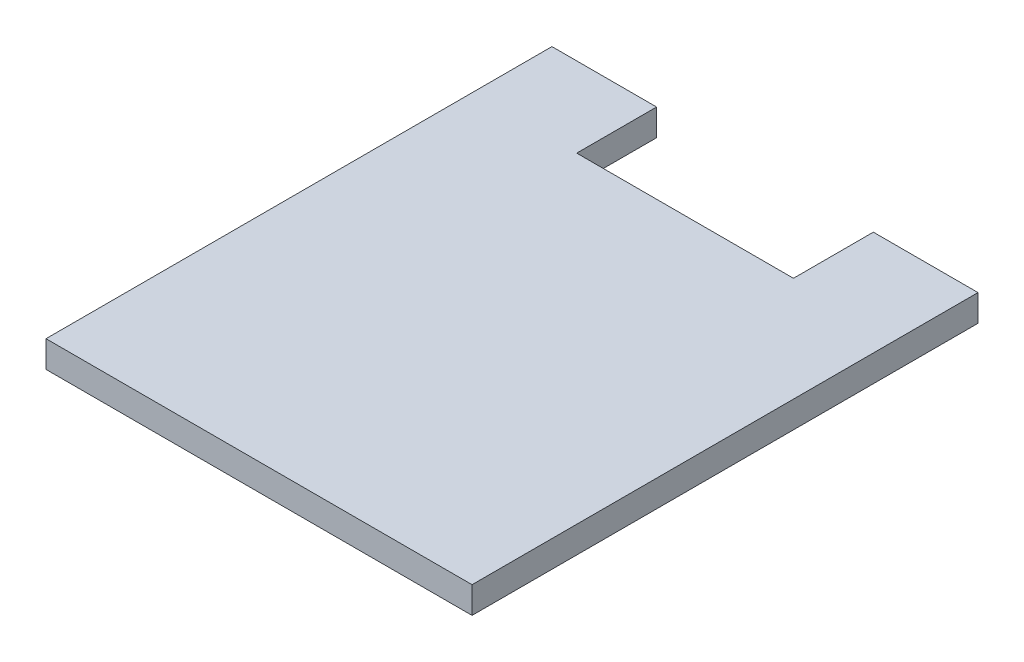
ISO-10303-21;
HEADER;
FILE_DESCRIPTION(('STEP AP214'),'2;1');
FILE_NAME('part.step','',(''),(''),'','','');
FILE_SCHEMA(('AUTOMOTIVE_DESIGN { 1 0 10303 214 1 1 1 1 }'));
ENDSEC;
DATA;
#1=APPLICATION_CONTEXT('core data for automotive mechanical design processes');
#2=APPLICATION_PROTOCOL_DEFINITION('international standard','automotive_design',2000,#1);
#3=PRODUCT_CONTEXT('',#1,'mechanical');
#4=PRODUCT('Part','Part','',(#3));
#5=PRODUCT_RELATED_PRODUCT_CATEGORY('part','',(#4));
#6=PRODUCT_DEFINITION_FORMATION('','',#4);
#7=PRODUCT_DEFINITION_CONTEXT('part definition',#1,'design');
#8=PRODUCT_DEFINITION('design','',#6,#7);
#9=PRODUCT_DEFINITION_SHAPE('','',#8);
#10=(LENGTH_UNIT() NAMED_UNIT(*) SI_UNIT(.MILLI.,.METRE.));
#11=(NAMED_UNIT(*) PLANE_ANGLE_UNIT() SI_UNIT($,.RADIAN.));
#12=(NAMED_UNIT(*) SI_UNIT($,.STERADIAN.) SOLID_ANGLE_UNIT());
#13=UNCERTAINTY_MEASURE_WITH_UNIT(LENGTH_MEASURE(1.E-05),#10,'distance_accuracy_value','');
#14=(GEOMETRIC_REPRESENTATION_CONTEXT(3) GLOBAL_UNCERTAINTY_ASSIGNED_CONTEXT((#13)) GLOBAL_UNIT_ASSIGNED_CONTEXT((#10,
#11,#12)) REPRESENTATION_CONTEXT('',''));
#15=CARTESIAN_POINT('',(0.,0.,0.));
#16=DIRECTION('',(0.,0.,1.));
#17=DIRECTION('',(1.,0.,0.));
#18=AXIS2_PLACEMENT_3D('',#15,#16,#17);
#19=CARTESIAN_POINT('',(0.,3.175,-60.325));
#20=DIRECTION('',(1.,0.,0.));
#21=DIRECTION('',(0.,0.,1.));
#22=AXIS2_PLACEMENT_3D('',#19,#20,#21);
#23=PLANE('',#22);
#24=DIRECTION('',(0.,0.,-1.));
#25=VECTOR('',#24,1.);
#26=CARTESIAN_POINT('',(0.,0.,-60.325));
#27=LINE('',#26,#25);
#28=CARTESIAN_POINT('',(0.,0.,0.));
#29=VERTEX_POINT('',#28);
#30=CARTESIAN_POINT('',(0.,0.,-60.325));
#31=VERTEX_POINT('',#30);
#32=EDGE_CURVE('E139',#29,#31,#27,.T.);
#33=ORIENTED_EDGE('',*,*,#32,.F.);
#34=DIRECTION('',(0.,-1.,0.));
#35=VECTOR('',#34,1.);
#36=CARTESIAN_POINT('',(0.,3.175,0.));
#37=LINE('',#36,#35);
#38=CARTESIAN_POINT('',(0.,3.175,0.));
#39=VERTEX_POINT('',#38);
#40=EDGE_CURVE('E138',#39,#29,#37,.T.);
#41=ORIENTED_EDGE('',*,*,#40,.F.);
#42=DIRECTION('',(0.,0.,-1.));
#43=VECTOR('',#42,1.);
#44=CARTESIAN_POINT('',(0.,3.175,-60.325));
#45=LINE('',#44,#43);
#46=CARTESIAN_POINT('',(0.,3.175,-60.325));
#47=VERTEX_POINT('',#46);
#48=EDGE_CURVE('E157',#39,#47,#45,.T.);
#49=ORIENTED_EDGE('',*,*,#48,.T.);
#50=DIRECTION('',(0.,-1.,0.));
#51=VECTOR('',#50,1.);
#52=CARTESIAN_POINT('',(0.,3.175,-60.325));
#53=LINE('',#52,#51);
#54=EDGE_CURVE('E11',#47,#31,#53,.T.);
#55=ORIENTED_EDGE('',*,*,#54,.T.);
#56=EDGE_LOOP('',(#33,#41,#49,#55));
#57=FACE_BOUND('',#56,.T.);
#58=ADVANCED_FACE('F43',(#57),#23,.F.);
#59=CARTESIAN_POINT('',(12.47775,3.175,-60.325));
#60=DIRECTION('',(0.,0.,1.));
#61=DIRECTION('',(-1.,0.,0.));
#62=AXIS2_PLACEMENT_3D('',#59,#60,#61);
#63=PLANE('',#62);
#64=DIRECTION('',(1.,0.,0.));
#65=VECTOR('',#64,1.);
#66=CARTESIAN_POINT('',(12.47775,0.,-60.325));
#67=LINE('',#66,#65);
#68=CARTESIAN_POINT('',(12.47775,0.,-60.325));
#69=VERTEX_POINT('',#68);
#70=EDGE_CURVE('E141',#31,#69,#67,.T.);
#71=ORIENTED_EDGE('',*,*,#70,.F.);
#72=ORIENTED_EDGE('',*,*,#54,.F.);
#73=DIRECTION('',(1.,0.,0.));
#74=VECTOR('',#73,1.);
#75=CARTESIAN_POINT('',(12.47775,3.175,-60.325));
#76=LINE('',#75,#74);
#77=CARTESIAN_POINT('',(12.47775,3.175,-60.325));
#78=VERTEX_POINT('',#77);
#79=EDGE_CURVE('E97',#47,#78,#76,.T.);
#80=ORIENTED_EDGE('',*,*,#79,.T.);
#81=DIRECTION('',(0.,-1.,0.));
#82=VECTOR('',#81,1.);
#83=CARTESIAN_POINT('',(12.47775,3.175,-60.325));
#84=LINE('',#83,#82);
#85=EDGE_CURVE('E51',#78,#69,#84,.T.);
#86=ORIENTED_EDGE('',*,*,#85,.T.);
#87=EDGE_LOOP('',(#71,#72,#80,#86));
#88=FACE_BOUND('',#87,.T.);
#89=ADVANCED_FACE('F169',(#88),#63,.F.);
#90=CARTESIAN_POINT('',(12.47775,3.175,-50.8));
#91=DIRECTION('',(-1.,0.,0.));
#92=DIRECTION('',(0.,0.,-1.));
#93=AXIS2_PLACEMENT_3D('',#90,#91,#92);
#94=PLANE('',#93);
#95=DIRECTION('',(0.,0.,1.));
#96=VECTOR('',#95,1.);
#97=CARTESIAN_POINT('',(12.47775,0.,-50.8));
#98=LINE('',#97,#96);
#99=CARTESIAN_POINT('',(12.47775,0.,-50.8));
#100=VERTEX_POINT('',#99);
#101=EDGE_CURVE('E144',#69,#100,#98,.T.);
#102=ORIENTED_EDGE('',*,*,#101,.F.);
#103=ORIENTED_EDGE('',*,*,#85,.F.);
#104=DIRECTION('',(0.,0.,1.));
#105=VECTOR('',#104,1.);
#106=CARTESIAN_POINT('',(12.47775,3.175,-50.8));
#107=LINE('',#106,#105);
#108=CARTESIAN_POINT('',(12.47775,3.175,-50.8));
#109=VERTEX_POINT('',#108);
#110=EDGE_CURVE('E178',#78,#109,#107,.T.);
#111=ORIENTED_EDGE('',*,*,#110,.T.);
#112=DIRECTION('',(0.,-1.,0.));
#113=VECTOR('',#112,1.);
#114=CARTESIAN_POINT('',(12.47775,3.175,-50.8));
#115=LINE('',#114,#113);
#116=EDGE_CURVE('E164',#109,#100,#115,.T.);
#117=ORIENTED_EDGE('',*,*,#116,.T.);
#118=EDGE_LOOP('',(#102,#103,#111,#117));
#119=FACE_BOUND('',#118,.T.);
#120=ADVANCED_FACE('F188',(#119),#94,.F.);
#121=CARTESIAN_POINT('',(38.32225,3.175,-50.8));
#122=DIRECTION('',(0.,0.,1.));
#123=DIRECTION('',(-1.,0.,0.));
#124=AXIS2_PLACEMENT_3D('',#121,#122,#123);
#125=PLANE('',#124);
#126=DIRECTION('',(1.,0.,0.));
#127=VECTOR('',#126,1.);
#128=CARTESIAN_POINT('',(38.32225,0.,-50.8));
#129=LINE('',#128,#127);
#130=CARTESIAN_POINT('',(38.32225,0.,-50.8));
#131=VERTEX_POINT('',#130);
#132=EDGE_CURVE('E147',#100,#131,#129,.T.);
#133=ORIENTED_EDGE('',*,*,#132,.F.);
#134=ORIENTED_EDGE('',*,*,#116,.F.);
#135=DIRECTION('',(1.,0.,0.));
#136=VECTOR('',#135,1.);
#137=CARTESIAN_POINT('',(38.32225,3.175,-50.8));
#138=LINE('',#137,#136);
#139=CARTESIAN_POINT('',(38.32225,3.175,-50.8));
#140=VERTEX_POINT('',#139);
#141=EDGE_CURVE('E133',#109,#140,#138,.T.);
#142=ORIENTED_EDGE('',*,*,#141,.T.);
#143=DIRECTION('',(0.,-1.,0.));
#144=VECTOR('',#143,1.);
#145=CARTESIAN_POINT('',(38.32225,3.175,-50.8));
#146=LINE('',#145,#144);
#147=EDGE_CURVE('E161',#140,#131,#146,.T.);
#148=ORIENTED_EDGE('',*,*,#147,.T.);
#149=EDGE_LOOP('',(#133,#134,#142,#148));
#150=FACE_BOUND('',#149,.T.);
#151=ADVANCED_FACE('F184',(#150),#125,.F.);
#152=CARTESIAN_POINT('',(38.32225,3.175,-60.325));
#153=DIRECTION('',(1.,0.,0.));
#154=DIRECTION('',(0.,0.,1.));
#155=AXIS2_PLACEMENT_3D('',#152,#153,#154);
#156=PLANE('',#155);
#157=DIRECTION('',(0.,0.,-1.));
#158=VECTOR('',#157,1.);
#159=CARTESIAN_POINT('',(38.32225,0.,-60.325));
#160=LINE('',#159,#158);
#161=CARTESIAN_POINT('',(38.32225,0.,-60.325));
#162=VERTEX_POINT('',#161);
#163=EDGE_CURVE('E150',#131,#162,#160,.T.);
#164=ORIENTED_EDGE('',*,*,#163,.F.);
#165=ORIENTED_EDGE('',*,*,#147,.F.);
#166=DIRECTION('',(0.,0.,-1.));
#167=VECTOR('',#166,1.);
#168=CARTESIAN_POINT('',(38.32225,3.175,-60.325));
#169=LINE('',#168,#167);
#170=CARTESIAN_POINT('',(38.32225,3.175,-60.325));
#171=VERTEX_POINT('',#170);
#172=EDGE_CURVE('E131',#140,#171,#169,.T.);
#173=ORIENTED_EDGE('',*,*,#172,.T.);
#174=DIRECTION('',(0.,-1.,0.));
#175=VECTOR('',#174,1.);
#176=CARTESIAN_POINT('',(38.32225,3.175,-60.325));
#177=LINE('',#176,#175);
#178=EDGE_CURVE('E125',#171,#162,#177,.T.);
#179=ORIENTED_EDGE('',*,*,#178,.T.);
#180=EDGE_LOOP('',(#164,#165,#173,#179));
#181=FACE_BOUND('',#180,.T.);
#182=ADVANCED_FACE('F187',(#181),#156,.F.);
#183=CARTESIAN_POINT('',(50.8,3.175,-60.325));
#184=DIRECTION('',(0.,0.,1.));
#185=DIRECTION('',(-1.,0.,0.));
#186=AXIS2_PLACEMENT_3D('',#183,#184,#185);
#187=PLANE('',#186);
#188=DIRECTION('',(1.,0.,0.));
#189=VECTOR('',#188,1.);
#190=CARTESIAN_POINT('',(50.8,0.,-60.325));
#191=LINE('',#190,#189);
#192=CARTESIAN_POINT('',(50.8,0.,-60.325));
#193=VERTEX_POINT('',#192);
#194=EDGE_CURVE('E153',#162,#193,#191,.T.);
#195=ORIENTED_EDGE('',*,*,#194,.F.);
#196=ORIENTED_EDGE('',*,*,#178,.F.);
#197=DIRECTION('',(1.,0.,0.));
#198=VECTOR('',#197,1.);
#199=CARTESIAN_POINT('',(50.8,3.175,-60.325));
#200=LINE('',#199,#198);
#201=CARTESIAN_POINT('',(50.8,3.175,-60.325));
#202=VERTEX_POINT('',#201);
#203=EDGE_CURVE('E115',#171,#202,#200,.T.);
#204=ORIENTED_EDGE('',*,*,#203,.T.);
#205=DIRECTION('',(0.,-1.,0.));
#206=VECTOR('',#205,1.);
#207=CARTESIAN_POINT('',(50.8,3.175,-60.325));
#208=LINE('',#207,#206);
#209=EDGE_CURVE('E120',#202,#193,#208,.T.);
#210=ORIENTED_EDGE('',*,*,#209,.T.);
#211=EDGE_LOOP('',(#195,#196,#204,#210));
#212=FACE_BOUND('',#211,.T.);
#213=ADVANCED_FACE('F128',(#212),#187,.F.);
#214=CARTESIAN_POINT('',(50.8,3.175,0.));
#215=DIRECTION('',(-1.,0.,0.));
#216=DIRECTION('',(0.,0.,-1.));
#217=AXIS2_PLACEMENT_3D('',#214,#215,#216);
#218=PLANE('',#217);
#219=DIRECTION('',(0.,0.,1.));
#220=VECTOR('',#219,1.);
#221=CARTESIAN_POINT('',(50.8,0.,0.));
#222=LINE('',#221,#220);
#223=CARTESIAN_POINT('',(50.8,0.,0.));
#224=VERTEX_POINT('',#223);
#225=EDGE_CURVE('E122',#193,#224,#222,.T.);
#226=ORIENTED_EDGE('',*,*,#225,.F.);
#227=ORIENTED_EDGE('',*,*,#209,.F.);
#228=DIRECTION('',(0.,0.,1.));
#229=VECTOR('',#228,1.);
#230=CARTESIAN_POINT('',(50.8,3.175,0.));
#231=LINE('',#230,#229);
#232=CARTESIAN_POINT('',(50.8,3.175,0.));
#233=VERTEX_POINT('',#232);
#234=EDGE_CURVE('E111',#202,#233,#231,.T.);
#235=ORIENTED_EDGE('',*,*,#234,.T.);
#236=DIRECTION('',(0.,-1.,0.));
#237=VECTOR('',#236,1.);
#238=CARTESIAN_POINT('',(50.8,3.175,0.));
#239=LINE('',#238,#237);
#240=EDGE_CURVE('E126',#233,#224,#239,.T.);
#241=ORIENTED_EDGE('',*,*,#240,.T.);
#242=EDGE_LOOP('',(#226,#227,#235,#241));
#243=FACE_BOUND('',#242,.T.);
#244=ADVANCED_FACE('F121',(#243),#218,.F.);
#245=CARTESIAN_POINT('',(0.,3.175,0.));
#246=DIRECTION('',(0.,0.,-1.));
#247=DIRECTION('',(1.,0.,0.));
#248=AXIS2_PLACEMENT_3D('',#245,#246,#247);
#249=PLANE('',#248);
#250=DIRECTION('',(-1.,0.,0.));
#251=VECTOR('',#250,1.);
#252=CARTESIAN_POINT('',(0.,0.,0.));
#253=LINE('',#252,#251);
#254=EDGE_CURVE('E85',#224,#29,#253,.T.);
#255=ORIENTED_EDGE('',*,*,#254,.F.);
#256=ORIENTED_EDGE('',*,*,#240,.F.);
#257=DIRECTION('',(-1.,0.,0.));
#258=VECTOR('',#257,1.);
#259=CARTESIAN_POINT('',(0.,3.175,0.));
#260=LINE('',#259,#258);
#261=EDGE_CURVE('E59',#233,#39,#260,.T.);
#262=ORIENTED_EDGE('',*,*,#261,.T.);
#263=ORIENTED_EDGE('',*,*,#40,.T.);
#264=EDGE_LOOP('',(#255,#256,#262,#263));
#265=FACE_BOUND('',#264,.T.);
#266=ADVANCED_FACE('F240',(#265),#249,.F.);
#267=CARTESIAN_POINT('',(0.,3.175,0.));
#268=DIRECTION('',(0.,-1.,0.));
#269=DIRECTION('',(0.,0.,1.));
#270=AXIS2_PLACEMENT_3D('',#267,#268,#269);
#271=PLANE('',#270);
#272=ORIENTED_EDGE('',*,*,#48,.F.);
#273=ORIENTED_EDGE('',*,*,#261,.F.);
#274=ORIENTED_EDGE('',*,*,#234,.F.);
#275=ORIENTED_EDGE('',*,*,#203,.F.);
#276=ORIENTED_EDGE('',*,*,#172,.F.);
#277=ORIENTED_EDGE('',*,*,#141,.F.);
#278=ORIENTED_EDGE('',*,*,#110,.F.);
#279=ORIENTED_EDGE('',*,*,#79,.F.);
#280=EDGE_LOOP('',(#272,#273,#274,#275,#276,#277,#278,#279));
#281=FACE_BOUND('',#280,.T.);
#282=ADVANCED_FACE('F113',(#281),#271,.F.);
#283=CARTESIAN_POINT('',(0.,0.,0.));
#284=DIRECTION('',(0.,-1.,0.));
#285=DIRECTION('',(0.,0.,1.));
#286=AXIS2_PLACEMENT_3D('',#283,#284,#285);
#287=PLANE('',#286);
#288=ORIENTED_EDGE('',*,*,#32,.T.);
#289=ORIENTED_EDGE('',*,*,#70,.T.);
#290=ORIENTED_EDGE('',*,*,#101,.T.);
#291=ORIENTED_EDGE('',*,*,#132,.T.);
#292=ORIENTED_EDGE('',*,*,#163,.T.);
#293=ORIENTED_EDGE('',*,*,#194,.T.);
#294=ORIENTED_EDGE('',*,*,#225,.T.);
#295=ORIENTED_EDGE('',*,*,#254,.T.);
#296=EDGE_LOOP('',(#288,#289,#290,#291,#292,#293,#294,#295));
#297=FACE_BOUND('',#296,.T.);
#298=ADVANCED_FACE('F172',(#297),#287,.T.);
#299=CLOSED_SHELL('',(#58,#89,#120,#151,#182,#213,#244,#266,#282,#298));
#300=MANIFOLD_SOLID_BREP('B2',#299);
#301=ADVANCED_BREP_SHAPE_REPRESENTATION('',(#18,#300),#14);
#302=SHAPE_DEFINITION_REPRESENTATION(#9,#301);
ENDSEC;
END-ISO-10303-21;
